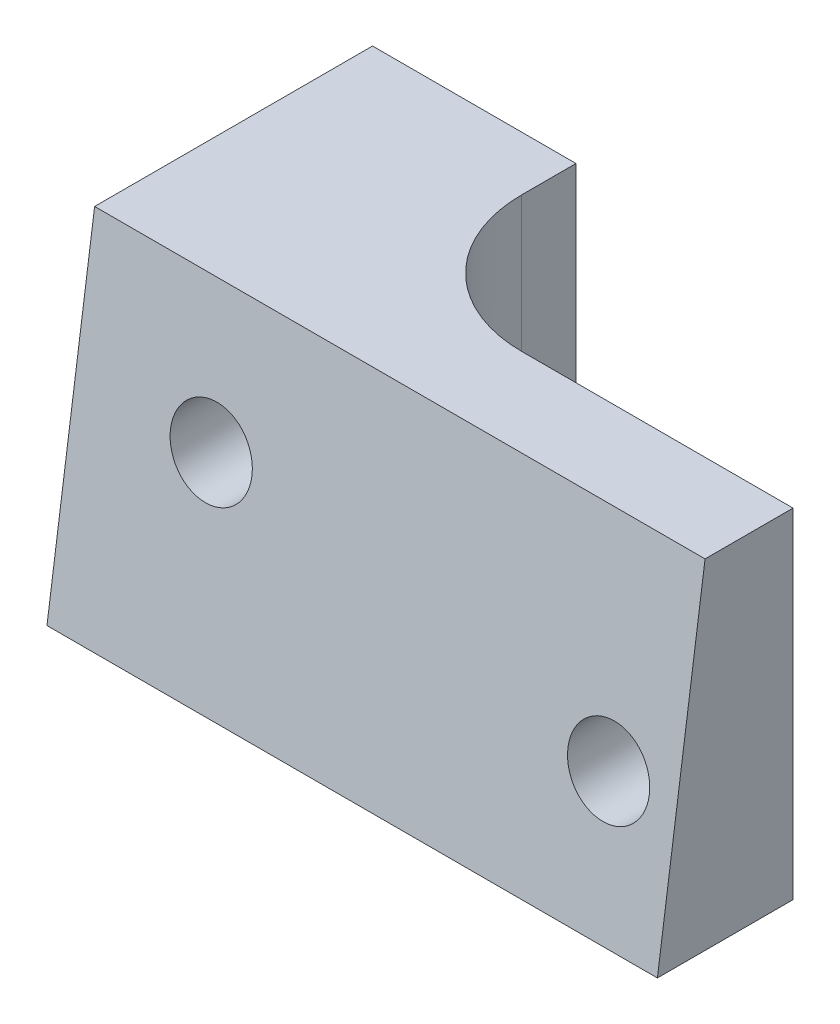
ISO-10303-21;
HEADER;
FILE_DESCRIPTION(('STEP AP214'),'2;1');
FILE_NAME('part.step','',(''),(''),'','','');
FILE_SCHEMA(('AUTOMOTIVE_DESIGN { 1 0 10303 214 1 1 1 1 }'));
ENDSEC;
DATA;
#1=APPLICATION_CONTEXT('core data for automotive mechanical design processes');
#2=APPLICATION_PROTOCOL_DEFINITION('international standard','automotive_design',2000,#1);
#3=PRODUCT_CONTEXT('',#1,'mechanical');
#4=PRODUCT('Part','Part','',(#3));
#5=PRODUCT_RELATED_PRODUCT_CATEGORY('part','',(#4));
#6=PRODUCT_DEFINITION_FORMATION('','',#4);
#7=PRODUCT_DEFINITION_CONTEXT('part definition',#1,'design');
#8=PRODUCT_DEFINITION('design','',#6,#7);
#9=PRODUCT_DEFINITION_SHAPE('','',#8);
#10=(LENGTH_UNIT() NAMED_UNIT(*) SI_UNIT(.MILLI.,.METRE.));
#11=(NAMED_UNIT(*) PLANE_ANGLE_UNIT() SI_UNIT($,.RADIAN.));
#12=(NAMED_UNIT(*) SI_UNIT($,.STERADIAN.) SOLID_ANGLE_UNIT());
#13=UNCERTAINTY_MEASURE_WITH_UNIT(LENGTH_MEASURE(1.E-05),#10,'distance_accuracy_value','');
#14=(GEOMETRIC_REPRESENTATION_CONTEXT(3) GLOBAL_UNCERTAINTY_ASSIGNED_CONTEXT((#13)) GLOBAL_UNIT_ASSIGNED_CONTEXT((#10,
#11,#12)) REPRESENTATION_CONTEXT('',''));
#15=CARTESIAN_POINT('',(0.,0.,0.));
#16=DIRECTION('',(0.,0.,1.));
#17=DIRECTION('',(1.,0.,0.));
#18=AXIS2_PLACEMENT_3D('',#15,#16,#17);
#19=CARTESIAN_POINT('',(0.,10.,-24.));
#20=DIRECTION('',(0.,-1.,0.));
#21=DIRECTION('',(0.,0.,-1.));
#22=AXIS2_PLACEMENT_3D('',#19,#20,#21);
#23=PLANE('',#22);
#24=DIRECTION('',(0.,0.,1.));
#25=VECTOR('',#24,1.);
#26=CARTESIAN_POINT('',(15.,10.,-24.));
#27=LINE('',#26,#25);
#28=CARTESIAN_POINT('',(15.,10.,-24.));
#29=VERTEX_POINT('',#28);
#30=CARTESIAN_POINT('',(15.,10.,-20.));
#31=VERTEX_POINT('',#30);
#32=EDGE_CURVE('E131',#29,#31,#27,.T.);
#33=ORIENTED_EDGE('',*,*,#32,.T.);
#34=DIRECTION('',(1.,0.,0.));
#35=VECTOR('',#34,1.);
#36=CARTESIAN_POINT('',(0.,10.,-20.));
#37=LINE('',#36,#35);
#38=CARTESIAN_POINT('',(0.,10.,-20.));
#39=VERTEX_POINT('',#38);
#40=EDGE_CURVE('E57',#31,#39,#37,.F.);
#41=ORIENTED_EDGE('',*,*,#40,.T.);
#42=DIRECTION('',(0.,0.,1.));
#43=VECTOR('',#42,1.);
#44=CARTESIAN_POINT('',(0.,10.,-24.));
#45=LINE('',#44,#43);
#46=CARTESIAN_POINT('',(0.,10.,-24.));
#47=VERTEX_POINT('',#46);
#48=EDGE_CURVE('E126',#47,#39,#45,.T.);
#49=ORIENTED_EDGE('',*,*,#48,.F.);
#50=DIRECTION('',(1.,0.,0.));
#51=VECTOR('',#50,1.);
#52=CARTESIAN_POINT('',(0.,10.,-24.));
#53=LINE('',#52,#51);
#54=EDGE_CURVE('E176',#47,#29,#53,.T.);
#55=ORIENTED_EDGE('',*,*,#54,.T.);
#56=EDGE_LOOP('',(#33,#41,#49,#55));
#57=FACE_BOUND('',#56,.T.);
#58=ADVANCED_FACE('F35',(#57),#23,.T.);
#59=CARTESIAN_POINT('',(15.,0.,-24.));
#60=DIRECTION('',(1.,0.,0.));
#61=DIRECTION('',(0.,0.,-1.));
#62=AXIS2_PLACEMENT_3D('',#59,#60,#61);
#63=PLANE('',#62);
#64=DIRECTION('',(0.,0.,1.));
#65=VECTOR('',#64,1.);
#66=CARTESIAN_POINT('',(15.,25.,-24.));
#67=LINE('',#66,#65);
#68=CARTESIAN_POINT('',(15.,25.,-24.));
#69=VERTEX_POINT('',#68);
#70=CARTESIAN_POINT('',(15.,25.,-20.));
#71=VERTEX_POINT('',#70);
#72=EDGE_CURVE('E127',#69,#71,#67,.T.);
#73=ORIENTED_EDGE('',*,*,#72,.T.);
#74=DIRECTION('',(0.,1.,0.));
#75=VECTOR('',#74,1.);
#76=CARTESIAN_POINT('',(15.,0.,-20.));
#77=LINE('',#76,#75);
#78=EDGE_CURVE('E142',#71,#31,#77,.F.);
#79=ORIENTED_EDGE('',*,*,#78,.T.);
#80=ORIENTED_EDGE('',*,*,#32,.F.);
#81=DIRECTION('',(0.,1.,0.));
#82=VECTOR('',#81,1.);
#83=CARTESIAN_POINT('',(15.,0.,-24.));
#84=LINE('',#83,#82);
#85=EDGE_CURVE('E179',#29,#69,#84,.T.);
#86=ORIENTED_EDGE('',*,*,#85,.T.);
#87=EDGE_LOOP('',(#73,#79,#80,#86));
#88=FACE_BOUND('',#87,.T.);
#89=ADVANCED_FACE('F209',(#88),#63,.T.);
#90=CARTESIAN_POINT('',(0.,0.,-24.));
#91=DIRECTION('',(1.,0.,0.));
#92=DIRECTION('',(0.,0.,-1.));
#93=AXIS2_PLACEMENT_3D('',#90,#91,#92);
#94=PLANE('',#93);
#95=DIRECTION('',(0.,0.,1.));
#96=VECTOR('',#95,1.);
#97=CARTESIAN_POINT('',(0.,0.,-10.));
#98=LINE('',#97,#96);
#99=CARTESIAN_POINT('',(0.,0.,-10.));
#100=VERTEX_POINT('',#99);
#101=CARTESIAN_POINT('',(0.,0.,0.));
#102=VERTEX_POINT('',#101);
#103=EDGE_CURVE('E120',#100,#102,#98,.T.);
#104=ORIENTED_EDGE('',*,*,#103,.T.);
#105=DIRECTION('',(0.,0.990268068741571,-0.139173100960058));
#106=VECTOR('',#105,1.);
#107=CARTESIAN_POINT('',(0.,0.,0.));
#108=LINE('',#107,#106);
#109=CARTESIAN_POINT('',(0.,25.,-3.5135208675596));
#110=VERTEX_POINT('',#109);
#111=EDGE_CURVE('E105',#102,#110,#108,.T.);
#112=ORIENTED_EDGE('',*,*,#111,.T.);
#113=DIRECTION('',(0.,0.,1.));
#114=VECTOR('',#113,1.);
#115=CARTESIAN_POINT('',(0.,25.,-24.));
#116=LINE('',#115,#114);
#117=CARTESIAN_POINT('',(0.,25.,-24.));
#118=VERTEX_POINT('',#117);
#119=EDGE_CURVE('E118',#118,#110,#116,.T.);
#120=ORIENTED_EDGE('',*,*,#119,.F.);
#121=DIRECTION('',(0.,1.,0.));
#122=VECTOR('',#121,1.);
#123=CARTESIAN_POINT('',(0.,0.,-24.));
#124=LINE('',#123,#122);
#125=EDGE_CURVE('E136',#47,#118,#124,.T.);
#126=ORIENTED_EDGE('',*,*,#125,.F.);
#127=ORIENTED_EDGE('',*,*,#48,.T.);
#128=CARTESIAN_POINT('',(0.,0.,-20.));
#129=DIRECTION('',(1.,0.,0.));
#130=DIRECTION('',(0.,0.,-1.));
#131=AXIS2_PLACEMENT_3D('',#128,#129,#130);
#132=CIRCLE('',#131,10.);
#133=EDGE_CURVE('E44',#39,#100,#132,.T.);
#134=ORIENTED_EDGE('',*,*,#133,.T.);
#135=EDGE_LOOP('',(#104,#112,#120,#126,#127,#134));
#136=FACE_BOUND('',#135,.T.);
#137=ADVANCED_FACE('F116',(#136),#94,.F.);
#138=CARTESIAN_POINT('',(0.,25.,-24.));
#139=DIRECTION('',(0.,-1.,0.));
#140=DIRECTION('',(0.,0.,-1.));
#141=AXIS2_PLACEMENT_3D('',#138,#139,#140);
#142=PLANE('',#141);
#143=ORIENTED_EDGE('',*,*,#119,.T.);
#144=DIRECTION('',(1.,0.,0.));
#145=VECTOR('',#144,1.);
#146=CARTESIAN_POINT('',(0.,25.,-3.5135208675596));
#147=LINE('',#146,#145);
#148=CARTESIAN_POINT('',(45.,25.,-3.5135208675596));
#149=VERTEX_POINT('',#148);
#150=EDGE_CURVE('E101',#110,#149,#147,.T.);
#151=ORIENTED_EDGE('',*,*,#150,.T.);
#152=DIRECTION('',(0.,0.,1.));
#153=VECTOR('',#152,1.);
#154=CARTESIAN_POINT('',(45.,25.,-10.));
#155=LINE('',#154,#153);
#156=CARTESIAN_POINT('',(45.,25.,-10.));
#157=VERTEX_POINT('',#156);
#158=EDGE_CURVE('E170',#157,#149,#155,.T.);
#159=ORIENTED_EDGE('',*,*,#158,.F.);
#160=DIRECTION('',(1.,0.,0.));
#161=VECTOR('',#160,1.);
#162=CARTESIAN_POINT('',(0.,25.,-10.));
#163=LINE('',#162,#161);
#164=CARTESIAN_POINT('',(25.,25.,-10.));
#165=VERTEX_POINT('',#164);
#166=EDGE_CURVE('E154',#165,#157,#163,.T.);
#167=ORIENTED_EDGE('',*,*,#166,.F.);
#168=CARTESIAN_POINT('',(25.,25.,-20.));
#169=DIRECTION('',(0.,-1.,0.));
#170=DIRECTION('',(0.,0.,-1.));
#171=AXIS2_PLACEMENT_3D('',#168,#169,#170);
#172=CIRCLE('',#171,10.);
#173=EDGE_CURVE('E11',#165,#71,#172,.T.);
#174=ORIENTED_EDGE('',*,*,#173,.T.);
#175=ORIENTED_EDGE('',*,*,#72,.F.);
#176=DIRECTION('',(1.,0.,0.));
#177=VECTOR('',#176,1.);
#178=CARTESIAN_POINT('',(0.,25.,-24.));
#179=LINE('',#178,#177);
#180=EDGE_CURVE('E124',#118,#69,#179,.T.);
#181=ORIENTED_EDGE('',*,*,#180,.F.);
#182=EDGE_LOOP('',(#143,#151,#159,#167,#174,#175,#181));
#183=FACE_BOUND('',#182,.T.);
#184=ADVANCED_FACE('F123',(#183),#142,.F.);
#185=CARTESIAN_POINT('',(10.,15.,-24.));
#186=DIRECTION('',(0.,0.,1.));
#187=DIRECTION('',(1.,0.,0.));
#188=AXIS2_PLACEMENT_3D('',#185,#186,#187);
#189=CYLINDRICAL_SURFACE('',#188,3.);
#190=CARTESIAN_POINT('',(10.,15.,-2.10811252053577));
#191=DIRECTION('',(0.,-0.139173100960058,-0.990268068741571));
#192=DIRECTION('',(0.,-0.990268068741571,0.139173100960058));
#193=AXIS2_PLACEMENT_3D('',#190,#191,#192);
#194=ELLIPSE('',#193,3.02948271755585,3.);
#195=CARTESIAN_POINT('',(10.,12.,-1.68649001642861));
#196=VERTEX_POINT('',#195);
#197=EDGE_CURVE('E139',#196,#196,#194,.F.);
#198=ORIENTED_EDGE('',*,*,#197,.T.);
#199=EDGE_LOOP('',(#198));
#200=FACE_BOUND('',#199,.T.);
#201=CARTESIAN_POINT('',(10.,15.,-24.));
#202=DIRECTION('',(0.,0.,1.));
#203=DIRECTION('',(1.,0.,0.));
#204=AXIS2_PLACEMENT_3D('',#201,#202,#203);
#205=CIRCLE('',#204,3.);
#206=CARTESIAN_POINT('',(13.,15.,-24.));
#207=VERTEX_POINT('',#206);
#208=EDGE_CURVE('E172',#207,#207,#205,.T.);
#209=ORIENTED_EDGE('',*,*,#208,.F.);
#210=EDGE_LOOP('',(#209));
#211=FACE_BOUND('',#210,.T.);
#212=ADVANCED_FACE('F194',(#200,#211),#189,.F.);
#213=CARTESIAN_POINT('',(0.,0.,-24.));
#214=DIRECTION('',(0.,0.,1.));
#215=DIRECTION('',(1.,0.,0.));
#216=AXIS2_PLACEMENT_3D('',#213,#214,#215);
#217=PLANE('',#216);
#218=ORIENTED_EDGE('',*,*,#208,.T.);
#219=EDGE_LOOP('',(#218));
#220=FACE_BOUND('',#219,.T.);
#221=ORIENTED_EDGE('',*,*,#54,.F.);
#222=ORIENTED_EDGE('',*,*,#125,.T.);
#223=ORIENTED_EDGE('',*,*,#180,.T.);
#224=ORIENTED_EDGE('',*,*,#85,.F.);
#225=EDGE_LOOP('',(#221,#222,#223,#224));
#226=FACE_BOUND('',#225,.T.);
#227=ADVANCED_FACE('F184',(#220,#226),#217,.F.);
#228=CARTESIAN_POINT('',(45.,0.,-10.));
#229=DIRECTION('',(1.,0.,0.));
#230=DIRECTION('',(0.,0.,-1.));
#231=AXIS2_PLACEMENT_3D('',#228,#229,#230);
#232=PLANE('',#231);
#233=DIRECTION('',(0.,0.990268068741571,-0.139173100960058));
#234=VECTOR('',#233,1.);
#235=CARTESIAN_POINT('',(45.,0.,0.));
#236=LINE('',#235,#234);
#237=CARTESIAN_POINT('',(45.,0.,0.));
#238=VERTEX_POINT('',#237);
#239=EDGE_CURVE('E108',#238,#149,#236,.T.);
#240=ORIENTED_EDGE('',*,*,#239,.F.);
#241=DIRECTION('',(0.,0.,1.));
#242=VECTOR('',#241,1.);
#243=CARTESIAN_POINT('',(45.,0.,-10.));
#244=LINE('',#243,#242);
#245=CARTESIAN_POINT('',(45.,0.,-10.));
#246=VERTEX_POINT('',#245);
#247=EDGE_CURVE('E153',#246,#238,#244,.T.);
#248=ORIENTED_EDGE('',*,*,#247,.F.);
#249=DIRECTION('',(0.,1.,0.));
#250=VECTOR('',#249,1.);
#251=CARTESIAN_POINT('',(45.,0.,-10.));
#252=LINE('',#251,#250);
#253=EDGE_CURVE('E159',#246,#157,#252,.T.);
#254=ORIENTED_EDGE('',*,*,#253,.T.);
#255=ORIENTED_EDGE('',*,*,#158,.T.);
#256=EDGE_LOOP('',(#240,#248,#254,#255));
#257=FACE_BOUND('',#256,.T.);
#258=ADVANCED_FACE('F243',(#257),#232,.T.);
#259=CARTESIAN_POINT('',(0.,0.,-10.));
#260=DIRECTION('',(0.,-1.,0.));
#261=DIRECTION('',(0.,0.,-1.));
#262=AXIS2_PLACEMENT_3D('',#259,#260,#261);
#263=PLANE('',#262);
#264=DIRECTION('',(1.,0.,0.));
#265=VECTOR('',#264,1.);
#266=CARTESIAN_POINT('',(0.,0.,0.));
#267=LINE('',#266,#265);
#268=EDGE_CURVE('E152',#102,#238,#267,.T.);
#269=ORIENTED_EDGE('',*,*,#268,.F.);
#270=ORIENTED_EDGE('',*,*,#103,.F.);
#271=DIRECTION('',(1.,0.,0.));
#272=VECTOR('',#271,1.);
#273=CARTESIAN_POINT('',(0.,0.,-10.));
#274=LINE('',#273,#272);
#275=CARTESIAN_POINT('',(25.,0.,-10.));
#276=VERTEX_POINT('',#275);
#277=EDGE_CURVE('E150',#100,#276,#274,.T.);
#278=ORIENTED_EDGE('',*,*,#277,.T.);
#279=EDGE_CURVE('E160',#276,#246,#274,.T.);
#280=ORIENTED_EDGE('',*,*,#279,.T.);
#281=ORIENTED_EDGE('',*,*,#247,.T.);
#282=EDGE_LOOP('',(#269,#270,#278,#280,#281));
#283=FACE_BOUND('',#282,.T.);
#284=ADVANCED_FACE('F149',(#283),#263,.T.);
#285=CARTESIAN_POINT('',(40.,10.,-10.));
#286=DIRECTION('',(0.,0.,1.));
#287=DIRECTION('',(1.,0.,0.));
#288=AXIS2_PLACEMENT_3D('',#285,#286,#287);
#289=CYLINDRICAL_SURFACE('',#288,3.);
#290=CARTESIAN_POINT('',(40.,10.,-1.40540834702384));
#291=DIRECTION('',(0.,-0.139173100960058,-0.990268068741571));
#292=DIRECTION('',(0.,-0.990268068741571,0.139173100960058));
#293=AXIS2_PLACEMENT_3D('',#290,#291,#292);
#294=ELLIPSE('',#293,3.02948271755585,3.);
#295=CARTESIAN_POINT('',(40.,7.,-0.98378584291669));
#296=VERTEX_POINT('',#295);
#297=EDGE_CURVE('E112',#296,#296,#294,.F.);
#298=ORIENTED_EDGE('',*,*,#297,.T.);
#299=EDGE_LOOP('',(#298));
#300=FACE_BOUND('',#299,.T.);
#301=CARTESIAN_POINT('',(40.,10.,-10.));
#302=DIRECTION('',(0.,0.,1.));
#303=DIRECTION('',(1.,0.,0.));
#304=AXIS2_PLACEMENT_3D('',#301,#302,#303);
#305=CIRCLE('',#304,3.);
#306=CARTESIAN_POINT('',(43.,10.,-10.));
#307=VERTEX_POINT('',#306);
#308=EDGE_CURVE('E164',#307,#307,#305,.T.);
#309=ORIENTED_EDGE('',*,*,#308,.F.);
#310=EDGE_LOOP('',(#309));
#311=FACE_BOUND('',#310,.T.);
#312=ADVANCED_FACE('F204',(#300,#311),#289,.F.);
#313=CARTESIAN_POINT('',(0.,0.,-10.));
#314=DIRECTION('',(0.,0.,1.));
#315=DIRECTION('',(1.,0.,0.));
#316=AXIS2_PLACEMENT_3D('',#313,#314,#315);
#317=PLANE('',#316);
#318=ORIENTED_EDGE('',*,*,#308,.T.);
#319=EDGE_LOOP('',(#318));
#320=FACE_BOUND('',#319,.T.);
#321=ORIENTED_EDGE('',*,*,#279,.F.);
#322=DIRECTION('',(0.,1.,0.));
#323=VECTOR('',#322,1.);
#324=CARTESIAN_POINT('',(25.,0.,-10.));
#325=LINE('',#324,#323);
#326=EDGE_CURVE('E129',#276,#165,#325,.T.);
#327=ORIENTED_EDGE('',*,*,#326,.T.);
#328=ORIENTED_EDGE('',*,*,#166,.T.);
#329=ORIENTED_EDGE('',*,*,#253,.F.);
#330=EDGE_LOOP('',(#321,#327,#328,#329));
#331=FACE_BOUND('',#330,.T.);
#332=ADVANCED_FACE('F197',(#320,#331),#317,.F.);
#333=CARTESIAN_POINT('',(0.,0.,0.));
#334=DIRECTION('',(0.,-0.139173100960058,-0.990268068741571));
#335=DIRECTION('',(0.,0.990268068741571,-0.139173100960058));
#336=AXIS2_PLACEMENT_3D('',#333,#334,#335);
#337=PLANE('',#336);
#338=ORIENTED_EDGE('',*,*,#297,.F.);
#339=EDGE_LOOP('',(#338));
#340=FACE_BOUND('',#339,.T.);
#341=ORIENTED_EDGE('',*,*,#239,.T.);
#342=ORIENTED_EDGE('',*,*,#150,.F.);
#343=ORIENTED_EDGE('',*,*,#111,.F.);
#344=ORIENTED_EDGE('',*,*,#268,.T.);
#345=EDGE_LOOP('',(#341,#342,#343,#344));
#346=FACE_BOUND('',#345,.T.);
#347=ORIENTED_EDGE('',*,*,#197,.F.);
#348=EDGE_LOOP('',(#347));
#349=FACE_BOUND('',#348,.T.);
#350=ADVANCED_FACE('F103',(#340,#346,#349),#337,.F.);
#351=CARTESIAN_POINT('',(25.,0.,-20.));
#352=DIRECTION('',(0.,1.,0.));
#353=DIRECTION('',(0.,0.,1.));
#354=AXIS2_PLACEMENT_3D('',#351,#352,#353);
#355=CYLINDRICAL_SURFACE('',#354,10.);
#356=ORIENTED_EDGE('',*,*,#173,.F.);
#357=ORIENTED_EDGE('',*,*,#326,.F.);
#358=CARTESIAN_POINT('',(25.,0.,-20.));
#359=DIRECTION('',(0.707106781186547,0.707106781186547,0.));
#360=DIRECTION('',(-0.707106781186547,0.707106781186547,0.));
#361=AXIS2_PLACEMENT_3D('',#358,#359,#360);
#362=ELLIPSE('',#361,14.1421356237309,10.);
#363=EDGE_CURVE('E39',#31,#276,#362,.T.);
#364=ORIENTED_EDGE('',*,*,#363,.F.);
#365=ORIENTED_EDGE('',*,*,#78,.F.);
#366=EDGE_LOOP('',(#356,#357,#364,#365));
#367=FACE_BOUND('',#366,.T.);
#368=ADVANCED_FACE('F37',(#367),#355,.F.);
#369=CARTESIAN_POINT('',(0.,0.,-20.));
#370=DIRECTION('',(1.,0.,0.));
#371=DIRECTION('',(0.,0.,-1.));
#372=AXIS2_PLACEMENT_3D('',#369,#370,#371);
#373=CYLINDRICAL_SURFACE('',#372,10.);
#374=ORIENTED_EDGE('',*,*,#133,.F.);
#375=ORIENTED_EDGE('',*,*,#40,.F.);
#376=ORIENTED_EDGE('',*,*,#363,.T.);
#377=ORIENTED_EDGE('',*,*,#277,.F.);
#378=EDGE_LOOP('',(#374,#375,#376,#377));
#379=FACE_BOUND('',#378,.T.);
#380=ADVANCED_FACE('F156',(#379),#373,.F.);
#381=CLOSED_SHELL('',(#58,#89,#137,#184,#212,#227,#258,#284,#312,#332,#350,#368,#380));
#382=MANIFOLD_SOLID_BREP('B2',#381);
#383=ADVANCED_BREP_SHAPE_REPRESENTATION('',(#18,#382),#14);
#384=SHAPE_DEFINITION_REPRESENTATION(#9,#383);
ENDSEC;
END-ISO-10303-21;
